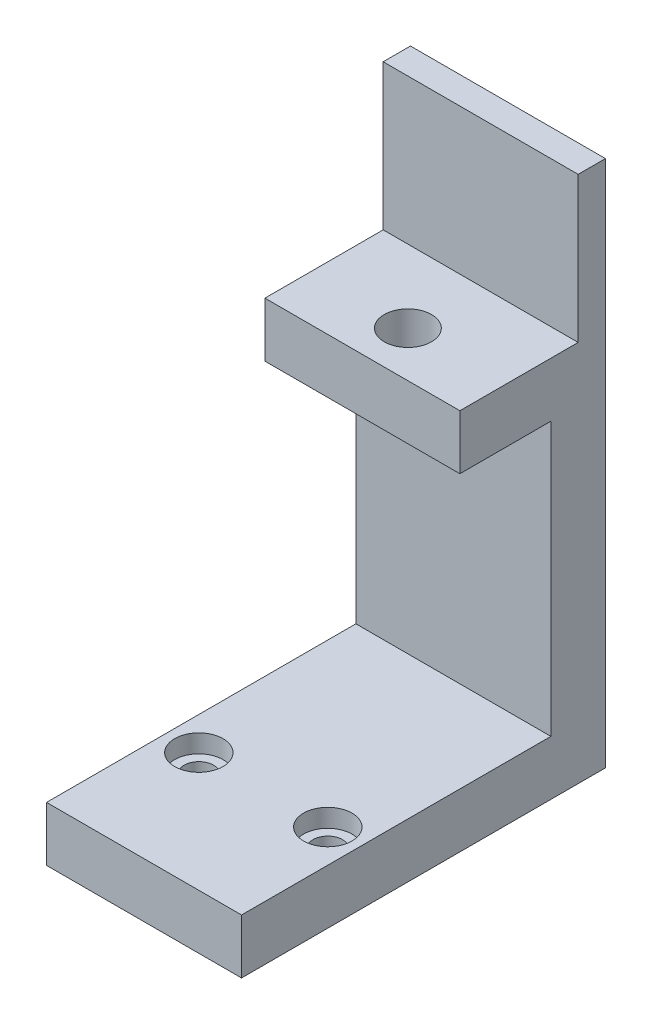
ISO-10303-21;
HEADER;
FILE_DESCRIPTION(('STEP AP214'),'2;1');
FILE_NAME('part.step','',(''),(''),'','','');
FILE_SCHEMA(('AUTOMOTIVE_DESIGN { 1 0 10303 214 1 1 1 1 }'));
ENDSEC;
DATA;
#1=APPLICATION_CONTEXT('core data for automotive mechanical design processes');
#2=APPLICATION_PROTOCOL_DEFINITION('international standard','automotive_design',2000,#1);
#3=PRODUCT_CONTEXT('',#1,'mechanical');
#4=PRODUCT('Part','Part','',(#3));
#5=PRODUCT_RELATED_PRODUCT_CATEGORY('part','',(#4));
#6=PRODUCT_DEFINITION_FORMATION('','',#4);
#7=PRODUCT_DEFINITION_CONTEXT('part definition',#1,'design');
#8=PRODUCT_DEFINITION('design','',#6,#7);
#9=PRODUCT_DEFINITION_SHAPE('','',#8);
#10=(LENGTH_UNIT() NAMED_UNIT(*) SI_UNIT(.MILLI.,.METRE.));
#11=(NAMED_UNIT(*) PLANE_ANGLE_UNIT() SI_UNIT($,.RADIAN.));
#12=(NAMED_UNIT(*) SI_UNIT($,.STERADIAN.) SOLID_ANGLE_UNIT());
#13=UNCERTAINTY_MEASURE_WITH_UNIT(LENGTH_MEASURE(1.E-05),#10,'distance_accuracy_value','');
#14=(GEOMETRIC_REPRESENTATION_CONTEXT(3) GLOBAL_UNCERTAINTY_ASSIGNED_CONTEXT((#13)) GLOBAL_UNIT_ASSIGNED_CONTEXT((#10,
#11,#12)) REPRESENTATION_CONTEXT('',''));
#15=CARTESIAN_POINT('',(0.,0.,0.));
#16=DIRECTION('',(0.,0.,1.));
#17=DIRECTION('',(1.,0.,0.));
#18=AXIS2_PLACEMENT_3D('',#15,#16,#17);
#19=CARTESIAN_POINT('',(-0.346834532374096,53.34,-28.4127338129496));
#20=DIRECTION('',(0.,-1.,0.));
#21=DIRECTION('',(0.,0.,-1.));
#22=AXIS2_PLACEMENT_3D('',#19,#20,#21);
#23=CYLINDRICAL_SURFACE('',#22,3.302);
#24=CARTESIAN_POINT('',(-0.346834532374096,53.34,-28.4127338129496));
#25=DIRECTION('',(0.,-1.,0.));
#26=DIRECTION('',(0.,0.,-1.));
#27=AXIS2_PLACEMENT_3D('',#24,#25,#26);
#28=CIRCLE('',#27,3.302);
#29=CARTESIAN_POINT('',(-0.346834532374096,53.34,-31.7147338129496));
#30=VERTEX_POINT('',#29);
#31=EDGE_CURVE('E157',#30,#30,#28,.T.);
#32=CARTESIAN_POINT('',(-0.346834532374096,48.26,-28.4127338129496));
#33=DIRECTION('',(0.,-1.,0.));
#34=DIRECTION('',(0.,0.,-1.));
#35=AXIS2_PLACEMENT_3D('',#32,#33,#34);
#36=CIRCLE('',#35,3.302);
#37=CARTESIAN_POINT('',(-0.346834532374096,48.26,-31.7147338129496));
#38=VERTEX_POINT('',#37);
#39=EDGE_CURVE('E46',#38,#38,#36,.F.);
#40=CARTESIAN_POINT('',(-0.346834532374096,53.34,-31.7147338129496));
#41=CARTESIAN_POINT('',(-0.346834532374096,53.2870833333333,-31.7147338129496));
#42=CARTESIAN_POINT('',(-0.346834532374096,53.2341666666667,-31.7147338129496));
#43=CARTESIAN_POINT('',(-0.346834532374096,53.1283333333333,-31.7147338129496));
#44=CARTESIAN_POINT('',(-0.346834532374096,53.0754166666667,-31.7147338129496));
#45=CARTESIAN_POINT('',(-0.346834532374096,52.9695833333333,-31.7147338129496));
#46=CARTESIAN_POINT('',(-0.346834532374096,52.9166666666667,-31.7147338129496));
#47=CARTESIAN_POINT('',(-0.346834532374096,52.8108333333333,-31.7147338129496));
#48=CARTESIAN_POINT('',(-0.346834532374096,52.7579166666667,-31.7147338129496));
#49=CARTESIAN_POINT('',(-0.346834532374096,52.6520833333333,-31.7147338129496));
#50=CARTESIAN_POINT('',(-0.346834532374096,52.5991666666667,-31.7147338129496));
#51=CARTESIAN_POINT('',(-0.346834532374096,52.4933333333333,-31.7147338129496));
#52=CARTESIAN_POINT('',(-0.346834532374096,52.4404166666667,-31.7147338129496));
#53=CARTESIAN_POINT('',(-0.346834532374096,52.3345833333333,-31.7147338129496));
#54=CARTESIAN_POINT('',(-0.346834532374096,52.2816666666667,-31.7147338129496));
#55=CARTESIAN_POINT('',(-0.346834532374096,52.1758333333333,-31.7147338129496));
#56=CARTESIAN_POINT('',(-0.346834532374096,52.1229166666667,-31.7147338129496));
#57=CARTESIAN_POINT('',(-0.346834532374096,52.0170833333333,-31.7147338129496));
#58=CARTESIAN_POINT('',(-0.346834532374096,51.9641666666667,-31.7147338129496));
#59=CARTESIAN_POINT('',(-0.346834532374096,51.8583333333333,-31.7147338129496));
#60=CARTESIAN_POINT('',(-0.346834532374096,51.8054166666667,-31.7147338129496));
#61=CARTESIAN_POINT('',(-0.346834532374096,51.6995833333333,-31.7147338129496));
#62=CARTESIAN_POINT('',(-0.346834532374096,51.6466666666667,-31.7147338129496));
#63=CARTESIAN_POINT('',(-0.346834532374096,51.5408333333333,-31.7147338129496));
#64=CARTESIAN_POINT('',(-0.346834532374096,51.4879166666667,-31.7147338129496));
#65=CARTESIAN_POINT('',(-0.346834532374096,51.3820833333333,-31.7147338129496));
#66=CARTESIAN_POINT('',(-0.346834532374096,51.3291666666667,-31.7147338129496));
#67=CARTESIAN_POINT('',(-0.346834532374096,51.2233333333333,-31.7147338129496));
#68=CARTESIAN_POINT('',(-0.346834532374096,51.1704166666667,-31.7147338129496));
#69=CARTESIAN_POINT('',(-0.346834532374096,51.0645833333333,-31.7147338129496));
#70=CARTESIAN_POINT('',(-0.346834532374096,51.0116666666667,-31.7147338129496));
#71=CARTESIAN_POINT('',(-0.346834532374096,50.9058333333333,-31.7147338129496));
#72=CARTESIAN_POINT('',(-0.346834532374096,50.8529166666667,-31.7147338129496));
#73=CARTESIAN_POINT('',(-0.346834532374096,50.7470833333333,-31.7147338129496));
#74=CARTESIAN_POINT('',(-0.346834532374096,50.6941666666667,-31.7147338129496));
#75=CARTESIAN_POINT('',(-0.346834532374096,50.5883333333333,-31.7147338129496));
#76=CARTESIAN_POINT('',(-0.346834532374096,50.5354166666667,-31.7147338129496));
#77=CARTESIAN_POINT('',(-0.346834532374096,50.4295833333333,-31.7147338129496));
#78=CARTESIAN_POINT('',(-0.346834532374096,50.3766666666667,-31.7147338129496));
#79=CARTESIAN_POINT('',(-0.346834532374096,50.2708333333333,-31.7147338129496));
#80=CARTESIAN_POINT('',(-0.346834532374096,50.2179166666667,-31.7147338129496));
#81=CARTESIAN_POINT('',(-0.346834532374096,50.1120833333333,-31.7147338129496));
#82=CARTESIAN_POINT('',(-0.346834532374096,50.0591666666667,-31.7147338129496));
#83=CARTESIAN_POINT('',(-0.346834532374096,49.9533333333333,-31.7147338129496));
#84=CARTESIAN_POINT('',(-0.346834532374096,49.9004166666667,-31.7147338129496));
#85=CARTESIAN_POINT('',(-0.346834532374096,49.7945833333333,-31.7147338129496));
#86=CARTESIAN_POINT('',(-0.346834532374096,49.7416666666667,-31.7147338129496));
#87=CARTESIAN_POINT('',(-0.346834532374096,49.6358333333333,-31.7147338129496));
#88=CARTESIAN_POINT('',(-0.346834532374096,49.5829166666667,-31.7147338129496));
#89=CARTESIAN_POINT('',(-0.346834532374096,49.4770833333333,-31.7147338129496));
#90=CARTESIAN_POINT('',(-0.346834532374096,49.4241666666667,-31.7147338129496));
#91=CARTESIAN_POINT('',(-0.346834532374096,49.3183333333333,-31.7147338129496));
#92=CARTESIAN_POINT('',(-0.346834532374096,49.2654166666667,-31.7147338129496));
#93=CARTESIAN_POINT('',(-0.346834532374096,49.1595833333333,-31.7147338129496));
#94=CARTESIAN_POINT('',(-0.346834532374096,49.1066666666667,-31.7147338129496));
#95=CARTESIAN_POINT('',(-0.346834532374096,49.0008333333333,-31.7147338129496));
#96=CARTESIAN_POINT('',(-0.346834532374096,48.9479166666667,-31.7147338129496));
#97=CARTESIAN_POINT('',(-0.346834532374096,48.8420833333333,-31.7147338129496));
#98=CARTESIAN_POINT('',(-0.346834532374096,48.7891666666667,-31.7147338129496));
#99=CARTESIAN_POINT('',(-0.346834532374096,48.6833333333333,-31.7147338129496));
#100=CARTESIAN_POINT('',(-0.346834532374096,48.6304166666667,-31.7147338129496));
#101=CARTESIAN_POINT('',(-0.346834532374096,48.5245833333333,-31.7147338129496));
#102=CARTESIAN_POINT('',(-0.346834532374096,48.4716666666667,-31.7147338129496));
#103=CARTESIAN_POINT('',(-0.346834532374096,48.3658333333333,-31.7147338129496));
#104=CARTESIAN_POINT('',(-0.346834532374096,48.3129166666667,-31.7147338129496));
#105=CARTESIAN_POINT('',(-0.346834532374096,48.26,-31.7147338129496));
#106=B_SPLINE_CURVE_WITH_KNOTS('',3,(#40,#41,#42,#43,#44,#45,#46,#47,#48,#49,#50,#51,#52,#53,
#54,#55,#56,#57,#58,#59,#60,#61,#62,#63,#64,#65,#66,#67,#68,#69,#70,#71,#72,#73,#74,#75,#76,#77,
#78,#79,#80,#81,#82,#83,#84,#85,#86,#87,#88,#89,#90,#91,#92,#93,#94,#95,#96,#97,#98,#99,#100,
#101,#102,#103,#104,#105),.UNSPECIFIED.,.F.,.F.,(4,2,2,2,2,2,2,2,2,2,2,2,2,2,2,2,2,2,2,2,2,2,2,
2,2,2,2,2,2,2,2,2,4),(0.,0.158749999999999,0.317499999999998,0.476249999999998,
0.634999999999997,0.793749999999996,0.952499999999995,1.11124999999999,1.26999999999999,1.42875,
1.5875,1.74625,1.905,2.06375,2.2225,2.38124999999999,2.53999999999999,2.69875,2.8575,3.01625,
3.175,3.33375,3.4925,3.65124999999999,3.80999999999999,3.96874999999999,4.1275,4.28625,4.445,
4.60375,4.7625,4.92125,5.07999999999999),.UNSPECIFIED.);
#107=EDGE_CURVE('BSEAM42',#30,#38,#106,.T.);
#108=ORIENTED_EDGE('',*,*,#31,.F.);
#109=ORIENTED_EDGE('',*,*,#39,.F.);
#110=ORIENTED_EDGE('',*,*,#107,.T.);
#111=ORIENTED_EDGE('',*,*,#107,.F.);
#112=EDGE_LOOP('',(#108,#110,#109,#111));
#113=FACE_BOUND('',#112,.T.);
#114=ADVANCED_FACE('F42',(#113),#23,.F.);
#115=CARTESIAN_POINT('',(-13.9568345323741,53.34,-34.7627338129496));
#116=DIRECTION('',(0.,0.,-1.));
#117=DIRECTION('',(-1.,0.,0.));
#118=AXIS2_PLACEMENT_3D('',#115,#116,#117);
#119=PLANE('',#118);
#120=DIRECTION('',(1.,0.,0.));
#121=VECTOR('',#120,1.);
#122=CARTESIAN_POINT('',(13.2631654676259,45.72,-34.7627338129496));
#123=LINE('',#122,#121);
#124=CARTESIAN_POINT('',(-13.9568345323741,45.72,-34.7627338129496));
#125=VERTEX_POINT('',#124);
#126=CARTESIAN_POINT('',(13.2631654676259,45.72,-34.7627338129496));
#127=VERTEX_POINT('',#126);
#128=EDGE_CURVE('E160',#125,#127,#123,.T.);
#129=ORIENTED_EDGE('',*,*,#128,.F.);
#130=DIRECTION('',(0.,-1.,0.));
#131=VECTOR('',#130,1.);
#132=CARTESIAN_POINT('',(-13.9568345323741,53.34,-34.7627338129496));
#133=LINE('',#132,#131);
#134=CARTESIAN_POINT('',(-13.9568345323741,7.62,-34.7627338129496));
#135=VERTEX_POINT('',#134);
#136=EDGE_CURVE('E67',#125,#135,#133,.T.);
#137=ORIENTED_EDGE('',*,*,#136,.T.);
#138=DIRECTION('',(1.,0.,0.));
#139=VECTOR('',#138,1.);
#140=CARTESIAN_POINT('',(-13.9568345323741,7.62,-34.7627338129496));
#141=LINE('',#140,#139);
#142=CARTESIAN_POINT('',(13.2631654676259,7.62,-34.7627338129496));
#143=VERTEX_POINT('',#142);
#144=EDGE_CURVE('E177',#135,#143,#141,.T.);
#145=ORIENTED_EDGE('',*,*,#144,.T.);
#146=DIRECTION('',(0.,-1.,0.));
#147=VECTOR('',#146,1.);
#148=CARTESIAN_POINT('',(13.2631654676259,53.34,-34.7627338129496));
#149=LINE('',#148,#147);
#150=EDGE_CURVE('E181',#127,#143,#149,.T.);
#151=ORIENTED_EDGE('',*,*,#150,.F.);
#152=EDGE_LOOP('',(#129,#137,#145,#151));
#153=FACE_BOUND('',#152,.T.);
#154=ADVANCED_FACE('F268',(#153),#119,.F.);
#155=CARTESIAN_POINT('',(8.6531654676259,0.,-8.23273381294964));
#156=DIRECTION('',(0.,1.,0.));
#157=DIRECTION('',(0.,0.,1.));
#158=AXIS2_PLACEMENT_3D('',#155,#156,#157);
#159=CYLINDRICAL_SURFACE('',#158,2.05);
#160=CARTESIAN_POINT('',(8.6531654676259,0.,-8.23273381294964));
#161=DIRECTION('',(0.,-1.,0.));
#162=DIRECTION('',(0.,0.,1.));
#163=AXIS2_PLACEMENT_3D('',#160,#161,#162);
#164=CIRCLE('',#163,2.05);
#165=CARTESIAN_POINT('',(8.6531654676259,0.,-6.18273381294964));
#166=VERTEX_POINT('',#165);
#167=EDGE_CURVE('E192',#166,#166,#164,.T.);
#168=CARTESIAN_POINT('',(8.6531654676259,5.08,-8.23273381294964));
#169=DIRECTION('',(0.,1.,0.));
#170=DIRECTION('',(0.,0.,1.));
#171=AXIS2_PLACEMENT_3D('',#168,#169,#170);
#172=CIRCLE('',#171,2.05);
#173=CARTESIAN_POINT('',(8.6531654676259,5.08,-6.18273381294964));
#174=VERTEX_POINT('',#173);
#175=EDGE_CURVE('E189',#174,#174,#172,.T.);
#176=CARTESIAN_POINT('',(8.6531654676259,0.,-6.18273381294964));
#177=CARTESIAN_POINT('',(8.6531654676259,0.0529166666666667,-6.18273381294964));
#178=CARTESIAN_POINT('',(8.6531654676259,0.105833333333333,-6.18273381294964));
#179=CARTESIAN_POINT('',(8.6531654676259,0.211666666666667,-6.18273381294964));
#180=CARTESIAN_POINT('',(8.6531654676259,0.264583333333333,-6.18273381294964));
#181=CARTESIAN_POINT('',(8.6531654676259,0.370416666666667,-6.18273381294964));
#182=CARTESIAN_POINT('',(8.6531654676259,0.423333333333333,-6.18273381294964));
#183=CARTESIAN_POINT('',(8.6531654676259,0.529166666666666,-6.18273381294964));
#184=CARTESIAN_POINT('',(8.6531654676259,0.582083333333333,-6.18273381294964));
#185=CARTESIAN_POINT('',(8.6531654676259,0.687916666666667,-6.18273381294964));
#186=CARTESIAN_POINT('',(8.6531654676259,0.740833333333333,-6.18273381294964));
#187=CARTESIAN_POINT('',(8.6531654676259,0.846666666666666,-6.18273381294964));
#188=CARTESIAN_POINT('',(8.6531654676259,0.899583333333333,-6.18273381294964));
#189=CARTESIAN_POINT('',(8.6531654676259,1.00541666666667,-6.18273381294964));
#190=CARTESIAN_POINT('',(8.6531654676259,1.05833333333333,-6.18273381294964));
#191=CARTESIAN_POINT('',(8.6531654676259,1.16416666666667,-6.18273381294964));
#192=CARTESIAN_POINT('',(8.6531654676259,1.21708333333333,-6.18273381294964));
#193=CARTESIAN_POINT('',(8.6531654676259,1.32291666666667,-6.18273381294964));
#194=CARTESIAN_POINT('',(8.6531654676259,1.37583333333333,-6.18273381294964));
#195=CARTESIAN_POINT('',(8.6531654676259,1.48166666666667,-6.18273381294964));
#196=CARTESIAN_POINT('',(8.6531654676259,1.53458333333333,-6.18273381294964));
#197=CARTESIAN_POINT('',(8.6531654676259,1.64041666666667,-6.18273381294964));
#198=CARTESIAN_POINT('',(8.6531654676259,1.69333333333333,-6.18273381294964));
#199=CARTESIAN_POINT('',(8.6531654676259,1.79916666666667,-6.18273381294964));
#200=CARTESIAN_POINT('',(8.6531654676259,1.85208333333333,-6.18273381294964));
#201=CARTESIAN_POINT('',(8.6531654676259,1.95791666666667,-6.18273381294964));
#202=CARTESIAN_POINT('',(8.6531654676259,2.01083333333333,-6.18273381294964));
#203=CARTESIAN_POINT('',(8.6531654676259,2.11666666666667,-6.18273381294964));
#204=CARTESIAN_POINT('',(8.6531654676259,2.16958333333333,-6.18273381294964));
#205=CARTESIAN_POINT('',(8.6531654676259,2.27541666666667,-6.18273381294964));
#206=CARTESIAN_POINT('',(8.6531654676259,2.32833333333333,-6.18273381294964));
#207=CARTESIAN_POINT('',(8.6531654676259,2.43416666666667,-6.18273381294964));
#208=CARTESIAN_POINT('',(8.6531654676259,2.48708333333333,-6.18273381294964));
#209=CARTESIAN_POINT('',(8.6531654676259,2.59291666666667,-6.18273381294964));
#210=CARTESIAN_POINT('',(8.6531654676259,2.64583333333333,-6.18273381294964));
#211=CARTESIAN_POINT('',(8.6531654676259,2.75166666666667,-6.18273381294964));
#212=CARTESIAN_POINT('',(8.6531654676259,2.80458333333333,-6.18273381294964));
#213=CARTESIAN_POINT('',(8.6531654676259,2.91041666666667,-6.18273381294964));
#214=CARTESIAN_POINT('',(8.6531654676259,2.96333333333333,-6.18273381294964));
#215=CARTESIAN_POINT('',(8.6531654676259,3.06916666666667,-6.18273381294964));
#216=CARTESIAN_POINT('',(8.6531654676259,3.12208333333333,-6.18273381294964));
#217=CARTESIAN_POINT('',(8.6531654676259,3.22791666666667,-6.18273381294964));
#218=CARTESIAN_POINT('',(8.6531654676259,3.28083333333333,-6.18273381294964));
#219=CARTESIAN_POINT('',(8.6531654676259,3.38666666666667,-6.18273381294964));
#220=CARTESIAN_POINT('',(8.6531654676259,3.43958333333333,-6.18273381294964));
#221=CARTESIAN_POINT('',(8.6531654676259,3.54541666666667,-6.18273381294964));
#222=CARTESIAN_POINT('',(8.6531654676259,3.59833333333333,-6.18273381294964));
#223=CARTESIAN_POINT('',(8.6531654676259,3.70416666666667,-6.18273381294964));
#224=CARTESIAN_POINT('',(8.6531654676259,3.75708333333333,-6.18273381294964));
#225=CARTESIAN_POINT('',(8.6531654676259,3.86291666666667,-6.18273381294964));
#226=CARTESIAN_POINT('',(8.6531654676259,3.91583333333333,-6.18273381294964));
#227=CARTESIAN_POINT('',(8.6531654676259,4.02166666666666,-6.18273381294964));
#228=CARTESIAN_POINT('',(8.6531654676259,4.07458333333333,-6.18273381294964));
#229=CARTESIAN_POINT('',(8.6531654676259,4.18041666666667,-6.18273381294964));
#230=CARTESIAN_POINT('',(8.6531654676259,4.23333333333333,-6.18273381294964));
#231=CARTESIAN_POINT('',(8.6531654676259,4.33916666666666,-6.18273381294964));
#232=CARTESIAN_POINT('',(8.6531654676259,4.39208333333333,-6.18273381294964));
#233=CARTESIAN_POINT('',(8.6531654676259,4.49791666666667,-6.18273381294964));
#234=CARTESIAN_POINT('',(8.6531654676259,4.55083333333333,-6.18273381294964));
#235=CARTESIAN_POINT('',(8.6531654676259,4.65666666666666,-6.18273381294964));
#236=CARTESIAN_POINT('',(8.6531654676259,4.70958333333333,-6.18273381294964));
#237=CARTESIAN_POINT('',(8.6531654676259,4.81541666666666,-6.18273381294964));
#238=CARTESIAN_POINT('',(8.6531654676259,4.86833333333333,-6.18273381294964));
#239=CARTESIAN_POINT('',(8.6531654676259,4.97416666666667,-6.18273381294964));
#240=CARTESIAN_POINT('',(8.6531654676259,5.02708333333333,-6.18273381294964));
#241=CARTESIAN_POINT('',(8.6531654676259,5.08,-6.18273381294964));
#242=B_SPLINE_CURVE_WITH_KNOTS('',3,(#176,#177,#178,#179,#180,#181,#182,#183,#184,#185,#186,
#187,#188,#189,#190,#191,#192,#193,#194,#195,#196,#197,#198,#199,#200,#201,#202,#203,#204,#205,
#206,#207,#208,#209,#210,#211,#212,#213,#214,#215,#216,#217,#218,#219,#220,#221,#222,#223,#224,
#225,#226,#227,#228,#229,#230,#231,#232,#233,#234,#235,#236,#237,#238,#239,#240,#241),
.UNSPECIFIED.,.F.,.F.,(4,2,2,2,2,2,2,2,2,2,2,2,2,2,2,2,2,2,2,2,2,2,2,2,2,2,2,2,2,2,2,2,4),(0.,
0.15875,0.3175,0.47625,0.635,0.79375,0.9525,1.11125,1.27,1.42875,1.5875,1.74625,1.905,2.06375,
2.2225,2.38125,2.54,2.69875,2.8575,3.01625,3.175,3.33375,3.4925,3.65125,3.81,3.96875,4.1275,
4.28625,4.445,4.60375,4.7625,4.92125,5.08),.UNSPECIFIED.);
#243=EDGE_CURVE('BSEAM231',#166,#174,#242,.T.);
#244=ORIENTED_EDGE('',*,*,#167,.T.);
#245=ORIENTED_EDGE('',*,*,#175,.T.);
#246=ORIENTED_EDGE('',*,*,#243,.T.);
#247=ORIENTED_EDGE('',*,*,#243,.F.);
#248=EDGE_LOOP('',(#244,#246,#245,#247));
#249=FACE_BOUND('',#248,.T.);
#250=ADVANCED_FACE('F231',(#249),#159,.F.);
#251=CARTESIAN_POINT('',(-9.3468345323741,0.,-8.23273381294964));
#252=DIRECTION('',(0.,1.,0.));
#253=DIRECTION('',(0.,0.,1.));
#254=AXIS2_PLACEMENT_3D('',#251,#252,#253);
#255=CYLINDRICAL_SURFACE('',#254,2.05);
#256=CARTESIAN_POINT('',(-9.3468345323741,0.,-8.23273381294964));
#257=DIRECTION('',(0.,1.,0.));
#258=DIRECTION('',(0.,0.,1.));
#259=AXIS2_PLACEMENT_3D('',#256,#257,#258);
#260=CIRCLE('',#259,2.05);
#261=CARTESIAN_POINT('',(-9.3468345323741,0.,-6.18273381294964));
#262=VERTEX_POINT('',#261);
#263=EDGE_CURVE('E202',#262,#262,#260,.T.);
#264=CARTESIAN_POINT('',(-9.3468345323741,5.08,-8.23273381294964));
#265=DIRECTION('',(0.,1.,0.));
#266=DIRECTION('',(0.,0.,1.));
#267=AXIS2_PLACEMENT_3D('',#264,#265,#266);
#268=CIRCLE('',#267,2.05);
#269=CARTESIAN_POINT('',(-9.3468345323741,5.08,-6.18273381294964));
#270=VERTEX_POINT('',#269);
#271=EDGE_CURVE('E199',#270,#270,#268,.F.);
#272=CARTESIAN_POINT('',(-9.3468345323741,0.,-6.18273381294964));
#273=CARTESIAN_POINT('',(-9.3468345323741,0.0529166666666667,-6.18273381294964));
#274=CARTESIAN_POINT('',(-9.3468345323741,0.105833333333333,-6.18273381294964));
#275=CARTESIAN_POINT('',(-9.3468345323741,0.211666666666667,-6.18273381294964));
#276=CARTESIAN_POINT('',(-9.3468345323741,0.264583333333333,-6.18273381294964));
#277=CARTESIAN_POINT('',(-9.3468345323741,0.370416666666667,-6.18273381294964));
#278=CARTESIAN_POINT('',(-9.3468345323741,0.423333333333333,-6.18273381294964));
#279=CARTESIAN_POINT('',(-9.3468345323741,0.529166666666666,-6.18273381294964));
#280=CARTESIAN_POINT('',(-9.3468345323741,0.582083333333333,-6.18273381294964));
#281=CARTESIAN_POINT('',(-9.3468345323741,0.687916666666667,-6.18273381294964));
#282=CARTESIAN_POINT('',(-9.3468345323741,0.740833333333333,-6.18273381294964));
#283=CARTESIAN_POINT('',(-9.3468345323741,0.846666666666666,-6.18273381294964));
#284=CARTESIAN_POINT('',(-9.3468345323741,0.899583333333333,-6.18273381294964));
#285=CARTESIAN_POINT('',(-9.3468345323741,1.00541666666667,-6.18273381294964));
#286=CARTESIAN_POINT('',(-9.3468345323741,1.05833333333333,-6.18273381294964));
#287=CARTESIAN_POINT('',(-9.3468345323741,1.16416666666667,-6.18273381294964));
#288=CARTESIAN_POINT('',(-9.3468345323741,1.21708333333333,-6.18273381294964));
#289=CARTESIAN_POINT('',(-9.3468345323741,1.32291666666667,-6.18273381294964));
#290=CARTESIAN_POINT('',(-9.3468345323741,1.37583333333333,-6.18273381294964));
#291=CARTESIAN_POINT('',(-9.3468345323741,1.48166666666667,-6.18273381294964));
#292=CARTESIAN_POINT('',(-9.3468345323741,1.53458333333333,-6.18273381294964));
#293=CARTESIAN_POINT('',(-9.3468345323741,1.64041666666667,-6.18273381294964));
#294=CARTESIAN_POINT('',(-9.3468345323741,1.69333333333333,-6.18273381294964));
#295=CARTESIAN_POINT('',(-9.3468345323741,1.79916666666667,-6.18273381294964));
#296=CARTESIAN_POINT('',(-9.3468345323741,1.85208333333333,-6.18273381294964));
#297=CARTESIAN_POINT('',(-9.3468345323741,1.95791666666667,-6.18273381294964));
#298=CARTESIAN_POINT('',(-9.3468345323741,2.01083333333333,-6.18273381294964));
#299=CARTESIAN_POINT('',(-9.3468345323741,2.11666666666667,-6.18273381294964));
#300=CARTESIAN_POINT('',(-9.3468345323741,2.16958333333333,-6.18273381294964));
#301=CARTESIAN_POINT('',(-9.3468345323741,2.27541666666667,-6.18273381294964));
#302=CARTESIAN_POINT('',(-9.3468345323741,2.32833333333333,-6.18273381294964));
#303=CARTESIAN_POINT('',(-9.3468345323741,2.43416666666667,-6.18273381294964));
#304=CARTESIAN_POINT('',(-9.3468345323741,2.48708333333333,-6.18273381294964));
#305=CARTESIAN_POINT('',(-9.3468345323741,2.59291666666667,-6.18273381294964));
#306=CARTESIAN_POINT('',(-9.3468345323741,2.64583333333333,-6.18273381294964));
#307=CARTESIAN_POINT('',(-9.3468345323741,2.75166666666667,-6.18273381294964));
#308=CARTESIAN_POINT('',(-9.3468345323741,2.80458333333333,-6.18273381294964));
#309=CARTESIAN_POINT('',(-9.3468345323741,2.91041666666667,-6.18273381294964));
#310=CARTESIAN_POINT('',(-9.3468345323741,2.96333333333333,-6.18273381294964));
#311=CARTESIAN_POINT('',(-9.3468345323741,3.06916666666667,-6.18273381294964));
#312=CARTESIAN_POINT('',(-9.3468345323741,3.12208333333333,-6.18273381294964));
#313=CARTESIAN_POINT('',(-9.3468345323741,3.22791666666667,-6.18273381294964));
#314=CARTESIAN_POINT('',(-9.3468345323741,3.28083333333333,-6.18273381294964));
#315=CARTESIAN_POINT('',(-9.3468345323741,3.38666666666667,-6.18273381294964));
#316=CARTESIAN_POINT('',(-9.3468345323741,3.43958333333333,-6.18273381294964));
#317=CARTESIAN_POINT('',(-9.3468345323741,3.54541666666667,-6.18273381294964));
#318=CARTESIAN_POINT('',(-9.3468345323741,3.59833333333333,-6.18273381294964));
#319=CARTESIAN_POINT('',(-9.3468345323741,3.70416666666667,-6.18273381294964));
#320=CARTESIAN_POINT('',(-9.3468345323741,3.75708333333333,-6.18273381294964));
#321=CARTESIAN_POINT('',(-9.3468345323741,3.86291666666667,-6.18273381294964));
#322=CARTESIAN_POINT('',(-9.3468345323741,3.91583333333333,-6.18273381294964));
#323=CARTESIAN_POINT('',(-9.3468345323741,4.02166666666666,-6.18273381294964));
#324=CARTESIAN_POINT('',(-9.3468345323741,4.07458333333333,-6.18273381294964));
#325=CARTESIAN_POINT('',(-9.3468345323741,4.18041666666667,-6.18273381294964));
#326=CARTESIAN_POINT('',(-9.3468345323741,4.23333333333333,-6.18273381294964));
#327=CARTESIAN_POINT('',(-9.3468345323741,4.33916666666666,-6.18273381294964));
#328=CARTESIAN_POINT('',(-9.3468345323741,4.39208333333333,-6.18273381294964));
#329=CARTESIAN_POINT('',(-9.3468345323741,4.49791666666667,-6.18273381294964));
#330=CARTESIAN_POINT('',(-9.3468345323741,4.55083333333333,-6.18273381294964));
#331=CARTESIAN_POINT('',(-9.3468345323741,4.65666666666666,-6.18273381294964));
#332=CARTESIAN_POINT('',(-9.3468345323741,4.70958333333333,-6.18273381294964));
#333=CARTESIAN_POINT('',(-9.3468345323741,4.81541666666666,-6.18273381294964));
#334=CARTESIAN_POINT('',(-9.3468345323741,4.86833333333333,-6.18273381294964));
#335=CARTESIAN_POINT('',(-9.3468345323741,4.97416666666667,-6.18273381294964));
#336=CARTESIAN_POINT('',(-9.3468345323741,5.02708333333333,-6.18273381294964));
#337=CARTESIAN_POINT('',(-9.3468345323741,5.08,-6.18273381294964));
#338=B_SPLINE_CURVE_WITH_KNOTS('',3,(#272,#273,#274,#275,#276,#277,#278,#279,#280,#281,#282,
#283,#284,#285,#286,#287,#288,#289,#290,#291,#292,#293,#294,#295,#296,#297,#298,#299,#300,#301,
#302,#303,#304,#305,#306,#307,#308,#309,#310,#311,#312,#313,#314,#315,#316,#317,#318,#319,#320,
#321,#322,#323,#324,#325,#326,#327,#328,#329,#330,#331,#332,#333,#334,#335,#336,#337),
.UNSPECIFIED.,.F.,.F.,(4,2,2,2,2,2,2,2,2,2,2,2,2,2,2,2,2,2,2,2,2,2,2,2,2,2,2,2,2,2,2,2,4),(0.,
0.15875,0.3175,0.47625,0.635,0.79375,0.9525,1.11125,1.27,1.42875,1.5875,1.74625,1.905,2.06375,
2.2225,2.38125,2.54,2.69875,2.8575,3.01625,3.175,3.33375,3.4925,3.65125,3.81,3.96875,4.1275,
4.28625,4.445,4.60375,4.7625,4.92125,5.08),.UNSPECIFIED.);
#339=EDGE_CURVE('BSEAM293',#262,#270,#338,.T.);
#340=ORIENTED_EDGE('',*,*,#263,.F.);
#341=ORIENTED_EDGE('',*,*,#271,.F.);
#342=ORIENTED_EDGE('',*,*,#339,.T.);
#343=ORIENTED_EDGE('',*,*,#339,.F.);
#344=EDGE_LOOP('',(#340,#342,#341,#343));
#345=FACE_BOUND('',#344,.T.);
#346=ADVANCED_FACE('F293',(#345),#255,.F.);
#347=CARTESIAN_POINT('',(-13.9568345323741,7.62,-42.3827338129496));
#348=DIRECTION('',(1.,0.,0.));
#349=DIRECTION('',(0.,0.,-1.));
#350=AXIS2_PLACEMENT_3D('',#347,#348,#349);
#351=PLANE('',#350);
#352=DIRECTION('',(0.,0.,1.));
#353=VECTOR('',#352,1.);
#354=CARTESIAN_POINT('',(-13.9568345323741,0.,-42.3827338129496));
#355=LINE('',#354,#353);
#356=CARTESIAN_POINT('',(-13.9568345323741,0.,-42.3827338129496));
#357=VERTEX_POINT('',#356);
#358=CARTESIAN_POINT('',(-13.9568345323741,0.,8.41726618705036));
#359=VERTEX_POINT('',#358);
#360=EDGE_CURVE('E205',#357,#359,#355,.T.);
#361=ORIENTED_EDGE('',*,*,#360,.T.);
#362=DIRECTION('',(0.,-1.,0.));
#363=VECTOR('',#362,1.);
#364=CARTESIAN_POINT('',(-13.9568345323741,7.62,8.41726618705036));
#365=LINE('',#364,#363);
#366=CARTESIAN_POINT('',(-13.9568345323741,7.62,8.41726618705036));
#367=VERTEX_POINT('',#366);
#368=EDGE_CURVE('E12',#367,#359,#365,.T.);
#369=ORIENTED_EDGE('',*,*,#368,.F.);
#370=DIRECTION('',(0.,0.,1.));
#371=VECTOR('',#370,1.);
#372=CARTESIAN_POINT('',(-13.9568345323741,7.62,-42.3827338129496));
#373=LINE('',#372,#371);
#374=EDGE_CURVE('E206',#135,#367,#373,.T.);
#375=ORIENTED_EDGE('',*,*,#374,.F.);
#376=ORIENTED_EDGE('',*,*,#136,.F.);
#377=DIRECTION('',(0.,0.,-1.));
#378=VECTOR('',#377,1.);
#379=CARTESIAN_POINT('',(-13.9568345323741,45.72,-22.0627338129496));
#380=LINE('',#379,#378);
#381=CARTESIAN_POINT('',(-13.9568345323741,45.72,-22.0627338129496));
#382=VERTEX_POINT('',#381);
#383=EDGE_CURVE('E175',#382,#125,#380,.T.);
#384=ORIENTED_EDGE('',*,*,#383,.F.);
#385=DIRECTION('',(0.,-1.,0.));
#386=VECTOR('',#385,1.);
#387=CARTESIAN_POINT('',(-13.9568345323741,53.34,-22.0627338129496));
#388=LINE('',#387,#386);
#389=CARTESIAN_POINT('',(-13.9568345323741,53.34,-22.0627338129496));
#390=VERTEX_POINT('',#389);
#391=EDGE_CURVE('E167',#390,#382,#388,.T.);
#392=ORIENTED_EDGE('',*,*,#391,.F.);
#393=DIRECTION('',(0.,0.,1.));
#394=VECTOR('',#393,1.);
#395=CARTESIAN_POINT('',(-13.9568345323741,53.34,-42.3827338129496));
#396=LINE('',#395,#394);
#397=CARTESIAN_POINT('',(-13.9568345323741,53.34,-38.5727338129496));
#398=VERTEX_POINT('',#397);
#399=EDGE_CURVE('E146',#398,#390,#396,.T.);
#400=ORIENTED_EDGE('',*,*,#399,.F.);
#401=DIRECTION('',(0.,-1.,0.));
#402=VECTOR('',#401,1.);
#403=CARTESIAN_POINT('',(-13.9568345323741,73.66,-38.5727338129496));
#404=LINE('',#403,#402);
#405=CARTESIAN_POINT('',(-13.9568345323741,73.66,-38.5727338129496));
#406=VERTEX_POINT('',#405);
#407=EDGE_CURVE('E127',#406,#398,#404,.T.);
#408=ORIENTED_EDGE('',*,*,#407,.F.);
#409=DIRECTION('',(0.,0.,1.));
#410=VECTOR('',#409,1.);
#411=CARTESIAN_POINT('',(-13.9568345323741,73.66,-42.3827338129496));
#412=LINE('',#411,#410);
#413=CARTESIAN_POINT('',(-13.9568345323741,73.66,-42.3827338129496));
#414=VERTEX_POINT('',#413);
#415=EDGE_CURVE('E134',#414,#406,#412,.T.);
#416=ORIENTED_EDGE('',*,*,#415,.F.);
#417=DIRECTION('',(0.,-1.,0.));
#418=VECTOR('',#417,1.);
#419=CARTESIAN_POINT('',(-13.9568345323741,7.62,-42.3827338129496));
#420=LINE('',#419,#418);
#421=EDGE_CURVE('E214',#414,#357,#420,.T.);
#422=ORIENTED_EDGE('',*,*,#421,.T.);
#423=EDGE_LOOP('',(#361,#369,#375,#376,#384,#392,#400,#408,#416,#422));
#424=FACE_BOUND('',#423,.T.);
#425=ADVANCED_FACE('F44',(#424),#351,.F.);
#426=CARTESIAN_POINT('',(-13.9568345323741,7.62,8.41726618705036));
#427=DIRECTION('',(0.,0.,-1.));
#428=DIRECTION('',(-1.,0.,0.));
#429=AXIS2_PLACEMENT_3D('',#426,#427,#428);
#430=PLANE('',#429);
#431=DIRECTION('',(1.,0.,0.));
#432=VECTOR('',#431,1.);
#433=CARTESIAN_POINT('',(-13.9568345323741,0.,8.41726618705036));
#434=LINE('',#433,#432);
#435=CARTESIAN_POINT('',(13.2631654676259,0.,8.41726618705036));
#436=VERTEX_POINT('',#435);
#437=EDGE_CURVE('E216',#359,#436,#434,.T.);
#438=ORIENTED_EDGE('',*,*,#437,.T.);
#439=DIRECTION('',(0.,-1.,0.));
#440=VECTOR('',#439,1.);
#441=CARTESIAN_POINT('',(13.2631654676259,7.62,8.41726618705036));
#442=LINE('',#441,#440);
#443=CARTESIAN_POINT('',(13.2631654676259,7.62,8.41726618705036));
#444=VERTEX_POINT('',#443);
#445=EDGE_CURVE('E51',#444,#436,#442,.T.);
#446=ORIENTED_EDGE('',*,*,#445,.F.);
#447=DIRECTION('',(1.,0.,0.));
#448=VECTOR('',#447,1.);
#449=CARTESIAN_POINT('',(-13.9568345323741,7.62,8.41726618705036));
#450=LINE('',#449,#448);
#451=EDGE_CURVE('E208',#367,#444,#450,.T.);
#452=ORIENTED_EDGE('',*,*,#451,.F.);
#453=ORIENTED_EDGE('',*,*,#368,.T.);
#454=EDGE_LOOP('',(#438,#446,#452,#453));
#455=FACE_BOUND('',#454,.T.);
#456=ADVANCED_FACE('F328',(#455),#430,.F.);
#457=CARTESIAN_POINT('',(13.2631654676259,7.62,-42.3827338129496));
#458=DIRECTION('',(-1.,0.,0.));
#459=DIRECTION('',(0.,0.,1.));
#460=AXIS2_PLACEMENT_3D('',#457,#458,#459);
#461=PLANE('',#460);
#462=DIRECTION('',(0.,0.,-1.));
#463=VECTOR('',#462,1.);
#464=CARTESIAN_POINT('',(13.2631654676259,0.,-42.3827338129496));
#465=LINE('',#464,#463);
#466=CARTESIAN_POINT('',(13.2631654676259,0.,-42.3827338129496));
#467=VERTEX_POINT('',#466);
#468=EDGE_CURVE('E218',#436,#467,#465,.T.);
#469=ORIENTED_EDGE('',*,*,#468,.T.);
#470=DIRECTION('',(0.,-1.,0.));
#471=VECTOR('',#470,1.);
#472=CARTESIAN_POINT('',(13.2631654676259,7.62,-42.3827338129496));
#473=LINE('',#472,#471);
#474=CARTESIAN_POINT('',(13.2631654676259,73.66,-42.3827338129496));
#475=VERTEX_POINT('',#474);
#476=EDGE_CURVE('E222',#475,#467,#473,.T.);
#477=ORIENTED_EDGE('',*,*,#476,.F.);
#478=DIRECTION('',(0.,0.,-1.));
#479=VECTOR('',#478,1.);
#480=CARTESIAN_POINT('',(13.2631654676259,73.66,-42.3827338129496));
#481=LINE('',#480,#479);
#482=CARTESIAN_POINT('',(13.2631654676259,73.66,-38.5727338129496));
#483=VERTEX_POINT('',#482);
#484=EDGE_CURVE('E133',#483,#475,#481,.T.);
#485=ORIENTED_EDGE('',*,*,#484,.F.);
#486=DIRECTION('',(0.,-1.,0.));
#487=VECTOR('',#486,1.);
#488=CARTESIAN_POINT('',(13.2631654676259,73.66,-38.5727338129496));
#489=LINE('',#488,#487);
#490=CARTESIAN_POINT('',(13.2631654676259,53.34,-38.5727338129496));
#491=VERTEX_POINT('',#490);
#492=EDGE_CURVE('E129',#483,#491,#489,.T.);
#493=ORIENTED_EDGE('',*,*,#492,.T.);
#494=DIRECTION('',(0.,0.,-1.));
#495=VECTOR('',#494,1.);
#496=CARTESIAN_POINT('',(13.2631654676259,53.34,-42.3827338129496));
#497=LINE('',#496,#495);
#498=CARTESIAN_POINT('',(13.2631654676259,53.34,-22.0627338129496));
#499=VERTEX_POINT('',#498);
#500=EDGE_CURVE('E179',#499,#491,#497,.T.);
#501=ORIENTED_EDGE('',*,*,#500,.F.);
#502=DIRECTION('',(0.,1.,0.));
#503=VECTOR('',#502,1.);
#504=CARTESIAN_POINT('',(13.2631654676259,53.34,-22.0627338129496));
#505=LINE('',#504,#503);
#506=CARTESIAN_POINT('',(13.2631654676259,45.72,-22.0627338129496));
#507=VERTEX_POINT('',#506);
#508=EDGE_CURVE('E161',#507,#499,#505,.T.);
#509=ORIENTED_EDGE('',*,*,#508,.F.);
#510=DIRECTION('',(0.,0.,-1.));
#511=VECTOR('',#510,1.);
#512=CARTESIAN_POINT('',(13.2631654676259,45.72,-22.0627338129496));
#513=LINE('',#512,#511);
#514=EDGE_CURVE('E171',#507,#127,#513,.T.);
#515=ORIENTED_EDGE('',*,*,#514,.T.);
#516=ORIENTED_EDGE('',*,*,#150,.T.);
#517=DIRECTION('',(0.,0.,-1.));
#518=VECTOR('',#517,1.);
#519=CARTESIAN_POINT('',(13.2631654676259,7.62,-42.3827338129496));
#520=LINE('',#519,#518);
#521=EDGE_CURVE('E211',#444,#143,#520,.T.);
#522=ORIENTED_EDGE('',*,*,#521,.F.);
#523=ORIENTED_EDGE('',*,*,#445,.T.);
#524=EDGE_LOOP('',(#469,#477,#485,#493,#501,#509,#515,#516,#522,#523));
#525=FACE_BOUND('',#524,.T.);
#526=ADVANCED_FACE('F313',(#525),#461,.F.);
#527=CARTESIAN_POINT('',(-13.9568345323741,7.62,-42.3827338129496));
#528=DIRECTION('',(0.,0.,1.));
#529=DIRECTION('',(1.,0.,0.));
#530=AXIS2_PLACEMENT_3D('',#527,#528,#529);
#531=PLANE('',#530);
#532=DIRECTION('',(-1.,0.,0.));
#533=VECTOR('',#532,1.);
#534=CARTESIAN_POINT('',(-13.9568345323741,0.,-42.3827338129496));
#535=LINE('',#534,#533);
#536=EDGE_CURVE('E209',#467,#357,#535,.T.);
#537=ORIENTED_EDGE('',*,*,#536,.T.);
#538=ORIENTED_EDGE('',*,*,#421,.F.);
#539=DIRECTION('',(-1.,0.,0.));
#540=VECTOR('',#539,1.);
#541=CARTESIAN_POINT('',(-13.9568345323741,73.66,-42.3827338129496));
#542=LINE('',#541,#540);
#543=EDGE_CURVE('E140',#475,#414,#542,.T.);
#544=ORIENTED_EDGE('',*,*,#543,.F.);
#545=ORIENTED_EDGE('',*,*,#476,.T.);
#546=EDGE_LOOP('',(#537,#538,#544,#545));
#547=FACE_BOUND('',#546,.T.);
#548=ADVANCED_FACE('F251',(#547),#531,.F.);
#549=CARTESIAN_POINT('',(0.,7.62,0.));
#550=DIRECTION('',(0.,1.,0.));
#551=DIRECTION('',(0.,0.,1.));
#552=AXIS2_PLACEMENT_3D('',#549,#550,#551);
#553=PLANE('',#552);
#554=ORIENTED_EDGE('',*,*,#144,.F.);
#555=ORIENTED_EDGE('',*,*,#374,.T.);
#556=ORIENTED_EDGE('',*,*,#451,.T.);
#557=ORIENTED_EDGE('',*,*,#521,.T.);
#558=EDGE_LOOP('',(#554,#555,#556,#557));
#559=FACE_BOUND('',#558,.T.);
#560=CARTESIAN_POINT('',(8.6531654676259,7.62,-8.23273381294964));
#561=DIRECTION('',(0.,-1.,0.));
#562=DIRECTION('',(0.,0.,1.));
#563=AXIS2_PLACEMENT_3D('',#560,#561,#562);
#564=CIRCLE('',#563,3.3782);
#565=CARTESIAN_POINT('',(8.6531654676259,7.62,-4.85453381294964));
#566=VERTEX_POINT('',#565);
#567=EDGE_CURVE('E185',#566,#566,#564,.T.);
#568=ORIENTED_EDGE('',*,*,#567,.T.);
#569=EDGE_LOOP('',(#568));
#570=FACE_BOUND('',#569,.T.);
#571=CARTESIAN_POINT('',(-9.3468345323741,7.62,-8.23273381294964));
#572=DIRECTION('',(0.,1.,0.));
#573=DIRECTION('',(0.,0.,1.));
#574=AXIS2_PLACEMENT_3D('',#571,#572,#573);
#575=CIRCLE('',#574,3.3782);
#576=CARTESIAN_POINT('',(-9.3468345323741,7.62,-4.85453381294964));
#577=VERTEX_POINT('',#576);
#578=EDGE_CURVE('E195',#577,#577,#575,.T.);
#579=ORIENTED_EDGE('',*,*,#578,.F.);
#580=EDGE_LOOP('',(#579));
#581=FACE_BOUND('',#580,.T.);
#582=ADVANCED_FACE('F247',(#559,#570,#581),#553,.T.);
#583=CARTESIAN_POINT('',(0.,0.,0.));
#584=DIRECTION('',(0.,1.,0.));
#585=DIRECTION('',(0.,0.,1.));
#586=AXIS2_PLACEMENT_3D('',#583,#584,#585);
#587=PLANE('',#586);
#588=ORIENTED_EDGE('',*,*,#167,.F.);
#589=EDGE_LOOP('',(#588));
#590=FACE_BOUND('',#589,.T.);
#591=ORIENTED_EDGE('',*,*,#263,.T.);
#592=EDGE_LOOP('',(#591));
#593=FACE_BOUND('',#592,.T.);
#594=ORIENTED_EDGE('',*,*,#360,.F.);
#595=ORIENTED_EDGE('',*,*,#536,.F.);
#596=ORIENTED_EDGE('',*,*,#468,.F.);
#597=ORIENTED_EDGE('',*,*,#437,.F.);
#598=EDGE_LOOP('',(#594,#595,#596,#597));
#599=FACE_BOUND('',#598,.T.);
#600=ADVANCED_FACE('F250',(#590,#593,#599),#587,.F.);
#601=CARTESIAN_POINT('',(-9.3468345323741,5.08,-8.23273381294964));
#602=DIRECTION('',(0.,1.,0.));
#603=DIRECTION('',(0.,0.,1.));
#604=AXIS2_PLACEMENT_3D('',#601,#602,#603);
#605=PLANE('',#604);
#606=CARTESIAN_POINT('',(-9.3468345323741,5.08,-8.23273381294964));
#607=DIRECTION('',(0.,1.,0.));
#608=DIRECTION('',(0.,0.,1.));
#609=AXIS2_PLACEMENT_3D('',#606,#607,#608);
#610=CIRCLE('',#609,3.3782);
#611=CARTESIAN_POINT('',(-9.3468345323741,5.08,-4.85453381294964));
#612=VERTEX_POINT('',#611);
#613=EDGE_CURVE('E196',#612,#612,#610,.T.);
#614=ORIENTED_EDGE('',*,*,#613,.T.);
#615=EDGE_LOOP('',(#614));
#616=FACE_BOUND('',#615,.T.);
#617=ORIENTED_EDGE('',*,*,#271,.T.);
#618=EDGE_LOOP('',(#617));
#619=FACE_BOUND('',#618,.T.);
#620=ADVANCED_FACE('F257',(#616,#619),#605,.T.);
#621=CARTESIAN_POINT('',(-9.3468345323741,5.08,-8.23273381294964));
#622=DIRECTION('',(0.,1.,0.));
#623=DIRECTION('',(0.,0.,1.));
#624=AXIS2_PLACEMENT_3D('',#621,#622,#623);
#625=CYLINDRICAL_SURFACE('',#624,3.3782);
#626=ORIENTED_EDGE('',*,*,#613,.F.);
#627=EDGE_LOOP('',(#626));
#628=FACE_BOUND('',#627,.T.);
#629=ORIENTED_EDGE('',*,*,#578,.T.);
#630=EDGE_LOOP('',(#629));
#631=FACE_BOUND('',#630,.T.);
#632=ADVANCED_FACE('F243',(#628,#631),#625,.F.);
#633=CARTESIAN_POINT('',(8.6531654676259,5.08,-8.23273381294964));
#634=DIRECTION('',(0.,1.,0.));
#635=DIRECTION('',(0.,0.,1.));
#636=AXIS2_PLACEMENT_3D('',#633,#634,#635);
#637=CYLINDRICAL_SURFACE('',#636,3.3782);
#638=CARTESIAN_POINT('',(8.6531654676259,5.08,-8.23273381294964));
#639=DIRECTION('',(0.,-1.,0.));
#640=DIRECTION('',(0.,0.,1.));
#641=AXIS2_PLACEMENT_3D('',#638,#639,#640);
#642=CIRCLE('',#641,3.3782);
#643=CARTESIAN_POINT('',(8.6531654676259,5.08,-4.85453381294964));
#644=VERTEX_POINT('',#643);
#645=EDGE_CURVE('E186',#644,#644,#642,.T.);
#646=ORIENTED_EDGE('',*,*,#645,.T.);
#647=EDGE_LOOP('',(#646));
#648=FACE_BOUND('',#647,.T.);
#649=ORIENTED_EDGE('',*,*,#567,.F.);
#650=EDGE_LOOP('',(#649));
#651=FACE_BOUND('',#650,.T.);
#652=ADVANCED_FACE('F237',(#648,#651),#637,.F.);
#653=CARTESIAN_POINT('',(8.6531654676259,5.08,-8.23273381294964));
#654=DIRECTION('',(0.,1.,0.));
#655=DIRECTION('',(0.,0.,1.));
#656=AXIS2_PLACEMENT_3D('',#653,#654,#655);
#657=PLANE('',#656);
#658=ORIENTED_EDGE('',*,*,#175,.F.);
#659=EDGE_LOOP('',(#658));
#660=FACE_BOUND('',#659,.T.);
#661=ORIENTED_EDGE('',*,*,#645,.F.);
#662=EDGE_LOOP('',(#661));
#663=FACE_BOUND('',#662,.T.);
#664=ADVANCED_FACE('F233',(#660,#663),#657,.T.);
#665=CARTESIAN_POINT('',(0.,53.34,0.));
#666=DIRECTION('',(0.,1.,0.));
#667=DIRECTION('',(0.,0.,1.));
#668=AXIS2_PLACEMENT_3D('',#665,#666,#667);
#669=PLANE('',#668);
#670=DIRECTION('',(1.,0.,0.));
#671=VECTOR('',#670,1.);
#672=CARTESIAN_POINT('',(-13.9568345323741,53.34,-38.5727338129496));
#673=LINE('',#672,#671);
#674=EDGE_CURVE('E59',#398,#491,#673,.T.);
#675=ORIENTED_EDGE('',*,*,#674,.F.);
#676=ORIENTED_EDGE('',*,*,#399,.T.);
#677=DIRECTION('',(-1.,0.,0.));
#678=VECTOR('',#677,1.);
#679=CARTESIAN_POINT('',(13.2631654676259,53.34,-22.0627338129496));
#680=LINE('',#679,#678);
#681=EDGE_CURVE('E164',#499,#390,#680,.T.);
#682=ORIENTED_EDGE('',*,*,#681,.F.);
#683=ORIENTED_EDGE('',*,*,#500,.T.);
#684=EDGE_LOOP('',(#675,#676,#682,#683));
#685=FACE_BOUND('',#684,.T.);
#686=ORIENTED_EDGE('',*,*,#31,.T.);
#687=EDGE_LOOP('',(#686));
#688=FACE_BOUND('',#687,.T.);
#689=ADVANCED_FACE('F236',(#685,#688),#669,.T.);
#690=CARTESIAN_POINT('',(13.2631654676259,45.72,-22.0627338129496));
#691=DIRECTION('',(0.,1.,0.));
#692=DIRECTION('',(0.,0.,1.));
#693=AXIS2_PLACEMENT_3D('',#690,#691,#692);
#694=PLANE('',#693);
#695=CARTESIAN_POINT('',(-0.346834532374096,45.72,-28.4127338129496));
#696=DIRECTION('',(0.,-1.,0.));
#697=DIRECTION('',(0.,0.,-1.));
#698=AXIS2_PLACEMENT_3D('',#695,#696,#697);
#699=CIRCLE('',#698,4.826);
#700=CARTESIAN_POINT('',(-0.346834532374096,45.72,-33.2387338129496));
#701=VERTEX_POINT('',#700);
#702=EDGE_CURVE('E147',#701,#701,#699,.T.);
#703=ORIENTED_EDGE('',*,*,#702,.F.);
#704=EDGE_LOOP('',(#703));
#705=FACE_BOUND('',#704,.T.);
#706=ORIENTED_EDGE('',*,*,#128,.T.);
#707=ORIENTED_EDGE('',*,*,#514,.F.);
#708=DIRECTION('',(1.,0.,0.));
#709=VECTOR('',#708,1.);
#710=CARTESIAN_POINT('',(13.2631654676259,45.72,-22.0627338129496));
#711=LINE('',#710,#709);
#712=EDGE_CURVE('E169',#382,#507,#711,.T.);
#713=ORIENTED_EDGE('',*,*,#712,.F.);
#714=ORIENTED_EDGE('',*,*,#383,.T.);
#715=EDGE_LOOP('',(#706,#707,#713,#714));
#716=FACE_BOUND('',#715,.T.);
#717=ADVANCED_FACE('F285',(#705,#716),#694,.F.);
#718=CARTESIAN_POINT('',(0.,0.,-22.0627338129496));
#719=DIRECTION('',(0.,0.,-1.));
#720=DIRECTION('',(-1.,0.,0.));
#721=AXIS2_PLACEMENT_3D('',#718,#719,#720);
#722=PLANE('',#721);
#723=ORIENTED_EDGE('',*,*,#508,.T.);
#724=ORIENTED_EDGE('',*,*,#681,.T.);
#725=ORIENTED_EDGE('',*,*,#391,.T.);
#726=ORIENTED_EDGE('',*,*,#712,.T.);
#727=EDGE_LOOP('',(#723,#724,#725,#726));
#728=FACE_BOUND('',#727,.T.);
#729=ADVANCED_FACE('F281',(#728),#722,.F.);
#730=CARTESIAN_POINT('',(-0.346834532374096,48.26,-28.4127338129496));
#731=DIRECTION('',(0.,-1.,0.));
#732=DIRECTION('',(0.,0.,-1.));
#733=AXIS2_PLACEMENT_3D('',#730,#731,#732);
#734=PLANE('',#733);
#735=CARTESIAN_POINT('',(-0.346834532374096,48.26,-28.4127338129496));
#736=DIRECTION('',(0.,-1.,0.));
#737=DIRECTION('',(0.,0.,-1.));
#738=AXIS2_PLACEMENT_3D('',#735,#736,#737);
#739=CIRCLE('',#738,4.826);
#740=CARTESIAN_POINT('',(-0.346834532374096,48.26,-33.2387338129496));
#741=VERTEX_POINT('',#740);
#742=EDGE_CURVE('E150',#741,#741,#739,.T.);
#743=ORIENTED_EDGE('',*,*,#742,.T.);
#744=EDGE_LOOP('',(#743));
#745=FACE_BOUND('',#744,.T.);
#746=ORIENTED_EDGE('',*,*,#39,.T.);
#747=EDGE_LOOP('',(#746));
#748=FACE_BOUND('',#747,.T.);
#749=ADVANCED_FACE('F284',(#745,#748),#734,.T.);
#750=CARTESIAN_POINT('',(-0.346834532374096,48.26,-28.4127338129496));
#751=DIRECTION('',(0.,-1.,0.));
#752=DIRECTION('',(0.,0.,-1.));
#753=AXIS2_PLACEMENT_3D('',#750,#751,#752);
#754=CYLINDRICAL_SURFACE('',#753,4.826);
#755=ORIENTED_EDGE('',*,*,#742,.F.);
#756=EDGE_LOOP('',(#755));
#757=FACE_BOUND('',#756,.T.);
#758=ORIENTED_EDGE('',*,*,#702,.T.);
#759=EDGE_LOOP('',(#758));
#760=FACE_BOUND('',#759,.T.);
#761=ADVANCED_FACE('F279',(#757,#760),#754,.F.);
#762=CARTESIAN_POINT('',(-13.9568345323741,73.66,-38.5727338129496));
#763=DIRECTION('',(0.,0.,-1.));
#764=DIRECTION('',(-1.,0.,0.));
#765=AXIS2_PLACEMENT_3D('',#762,#763,#764);
#766=PLANE('',#765);
#767=ORIENTED_EDGE('',*,*,#674,.T.);
#768=ORIENTED_EDGE('',*,*,#492,.F.);
#769=DIRECTION('',(1.,0.,0.));
#770=VECTOR('',#769,1.);
#771=CARTESIAN_POINT('',(-13.9568345323741,73.66,-38.5727338129496));
#772=LINE('',#771,#770);
#773=EDGE_CURVE('E123',#406,#483,#772,.T.);
#774=ORIENTED_EDGE('',*,*,#773,.F.);
#775=ORIENTED_EDGE('',*,*,#407,.T.);
#776=EDGE_LOOP('',(#767,#768,#774,#775));
#777=FACE_BOUND('',#776,.T.);
#778=ADVANCED_FACE('F125',(#777),#766,.F.);
#779=CARTESIAN_POINT('',(0.,73.66,0.));
#780=DIRECTION('',(0.,1.,0.));
#781=DIRECTION('',(0.,0.,1.));
#782=AXIS2_PLACEMENT_3D('',#779,#780,#781);
#783=PLANE('',#782);
#784=ORIENTED_EDGE('',*,*,#415,.T.);
#785=ORIENTED_EDGE('',*,*,#773,.T.);
#786=ORIENTED_EDGE('',*,*,#484,.T.);
#787=ORIENTED_EDGE('',*,*,#543,.T.);
#788=EDGE_LOOP('',(#784,#785,#786,#787));
#789=FACE_BOUND('',#788,.T.);
#790=ADVANCED_FACE('F138',(#789),#783,.T.);
#791=CLOSED_SHELL('',(#114,#154,#250,#346,#425,#456,#526,#548,#582,#600,#620,#632,#652,#664,
#689,#717,#729,#749,#761,#778,#790));
#792=MANIFOLD_SOLID_BREP('B2',#791);
#793=ADVANCED_BREP_SHAPE_REPRESENTATION('',(#18,#792),#14);
#794=SHAPE_DEFINITION_REPRESENTATION(#9,#793);
ENDSEC;
END-ISO-10303-21;
